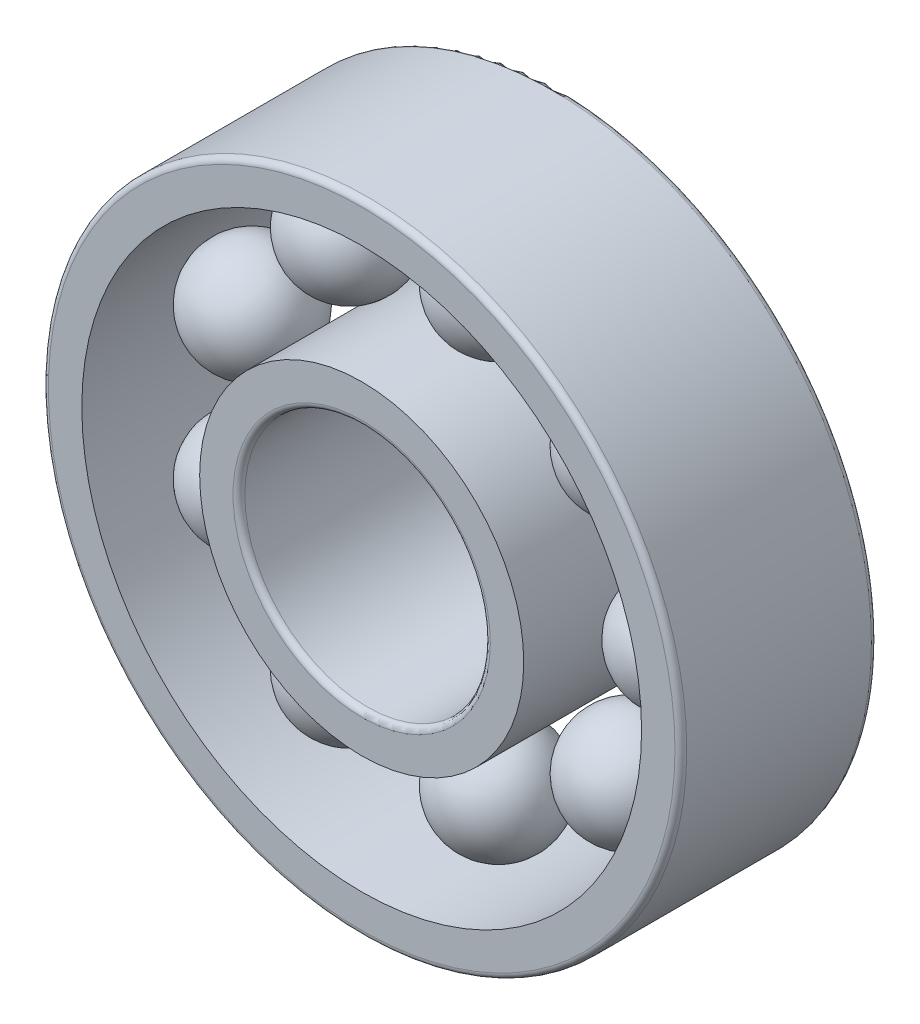
ISO-10303-21;
HEADER;
FILE_DESCRIPTION(('STEP AP214'),'2;1');
FILE_NAME('part.step','',(''),(''),'','','');
FILE_SCHEMA(('AUTOMOTIVE_DESIGN { 1 0 10303 214 1 1 1 1 }'));
ENDSEC;
DATA;
#1=APPLICATION_CONTEXT('core data for automotive mechanical design processes');
#2=APPLICATION_PROTOCOL_DEFINITION('international standard','automotive_design',2000,#1);
#3=PRODUCT_CONTEXT('',#1,'mechanical');
#4=PRODUCT('Part','Part','',(#3));
#5=PRODUCT_RELATED_PRODUCT_CATEGORY('part','',(#4));
#6=PRODUCT_DEFINITION_FORMATION('','',#4);
#7=PRODUCT_DEFINITION_CONTEXT('part definition',#1,'design');
#8=PRODUCT_DEFINITION('design','',#6,#7);
#9=PRODUCT_DEFINITION_SHAPE('','',#8);
#10=(LENGTH_UNIT() NAMED_UNIT(*) SI_UNIT(.MILLI.,.METRE.));
#11=(NAMED_UNIT(*) PLANE_ANGLE_UNIT() SI_UNIT($,.RADIAN.));
#12=(NAMED_UNIT(*) SI_UNIT($,.STERADIAN.) SOLID_ANGLE_UNIT());
#13=UNCERTAINTY_MEASURE_WITH_UNIT(LENGTH_MEASURE(1.E-05),#10,'distance_accuracy_value','');
#14=(GEOMETRIC_REPRESENTATION_CONTEXT(3) GLOBAL_UNCERTAINTY_ASSIGNED_CONTEXT((#13)) GLOBAL_UNIT_ASSIGNED_CONTEXT((#10,
#11,#12)) REPRESENTATION_CONTEXT('',''));
#15=CARTESIAN_POINT('',(0.,0.,0.));
#16=DIRECTION('',(0.,0.,1.));
#17=DIRECTION('',(1.,0.,0.));
#18=AXIS2_PLACEMENT_3D('',#15,#16,#17);
#19=CARTESIAN_POINT('',(6.8943999880708,-5.78508848717886,0.));
#20=DIRECTION('',(-0.766044443118978,0.64278760968654,0.));
#21=DIRECTION('',(0.,0.,-1.));
#22=AXIS2_PLACEMENT_3D('',#19,#20,#21);
#23=SPHERICAL_SURFACE('',#22,2.28);
#24=CARTESIAN_POINT('',(5.14781865775953,-4.31953273709355,0.));
#25=VERTEX_POINT('',#24);
#26=VERTEX_LOOP('',#25);
#27=FACE_BOUND('',#26,.T.);
#28=ADVANCED_FACE('F38',(#27),#23,.T.);
#29=CLOSED_SHELL('',(#28));
#30=MANIFOLD_SOLID_BREP('B2',#29);
#31=CARTESIAN_POINT('',(1.56283359900237,-8.86326977710987,0.));
#32=DIRECTION('',(-0.17364817766693,0.984807753012208,0.));
#33=DIRECTION('',(0.,0.,-1.));
#34=AXIS2_PLACEMENT_3D('',#31,#32,#33);
#35=SPHERICAL_SURFACE('',#34,2.28);
#36=CARTESIAN_POINT('',(1.16691575392177,-6.61790810024204,0.));
#37=VERTEX_POINT('',#36);
#38=VERTEX_LOOP('',#37);
#39=FACE_BOUND('',#38,.T.);
#40=ADVANCED_FACE('F57',(#39),#35,.T.);
#41=CLOSED_SHELL('',(#40));
#42=MANIFOLD_SOLID_BREP('B6',#41);
#43=CARTESIAN_POINT('',(-4.5,-7.79422863405995,0.));
#44=DIRECTION('',(0.5,0.866025403784438,0.));
#45=DIRECTION('',(0.,0.,-1.));
#46=AXIS2_PLACEMENT_3D('',#43,#44,#45);
#47=SPHERICAL_SURFACE('',#46,2.28);
#48=CARTESIAN_POINT('',(-3.36,-5.81969071343143,0.));
#49=VERTEX_POINT('',#48);
#50=VERTEX_LOOP('',#49);
#51=FACE_BOUND('',#50,.T.);
#52=ADVANCED_FACE('F76',(#51),#47,.T.);
#53=CLOSED_SHELL('',(#52));
#54=MANIFOLD_SOLID_BREP('B34',#53);
#55=CARTESIAN_POINT('',(-8.45723358707318,-3.07818128993102,0.));
#56=DIRECTION('',(0.939692620785908,0.342020143325669,0.));
#57=DIRECTION('',(0.,0.,-1.));
#58=AXIS2_PLACEMENT_3D('',#55,#56,#57);
#59=SPHERICAL_SURFACE('',#58,2.28);
#60=CARTESIAN_POINT('',(-6.3147344116813,-2.29837536314849,0.));
#61=VERTEX_POINT('',#60);
#62=VERTEX_LOOP('',#61);
#63=FACE_BOUND('',#62,.T.);
#64=ADVANCED_FACE('F95',(#63),#59,.T.);
#65=CLOSED_SHELL('',(#64));
#66=MANIFOLD_SOLID_BREP('B53',#65);
#67=CARTESIAN_POINT('',(-8.45723358707318,3.07818128993102,0.));
#68=DIRECTION('',(0.939692620785909,-0.342020143325669,0.));
#69=DIRECTION('',(0.,0.,-1.));
#70=AXIS2_PLACEMENT_3D('',#67,#68,#69);
#71=SPHERICAL_SURFACE('',#70,2.28);
#72=CARTESIAN_POINT('',(-6.31473441168131,2.2983753631485,0.));
#73=VERTEX_POINT('',#72);
#74=VERTEX_LOOP('',#73);
#75=FACE_BOUND('',#74,.T.);
#76=ADVANCED_FACE('F114',(#75),#71,.T.);
#77=CLOSED_SHELL('',(#76));
#78=MANIFOLD_SOLID_BREP('B72',#77);
#79=CARTESIAN_POINT('',(-4.5,7.79422863405995,0.));
#80=DIRECTION('',(0.5,-0.866025403784439,0.));
#81=DIRECTION('',(0.,0.,-1.));
#82=AXIS2_PLACEMENT_3D('',#79,#80,#81);
#83=SPHERICAL_SURFACE('',#82,2.28);
#84=CARTESIAN_POINT('',(-3.36,5.81969071343143,0.));
#85=VERTEX_POINT('',#84);
#86=VERTEX_LOOP('',#85);
#87=FACE_BOUND('',#86,.T.);
#88=ADVANCED_FACE('F133',(#87),#83,.T.);
#89=CLOSED_SHELL('',(#88));
#90=MANIFOLD_SOLID_BREP('B91',#89);
#91=CARTESIAN_POINT('',(1.56283359900237,8.86326977710987,0.));
#92=DIRECTION('',(-0.17364817766693,-0.984807753012208,0.));
#93=DIRECTION('',(0.,0.,-1.));
#94=AXIS2_PLACEMENT_3D('',#91,#92,#93);
#95=SPHERICAL_SURFACE('',#94,2.28);
#96=CARTESIAN_POINT('',(1.16691575392177,6.61790810024204,0.));
#97=VERTEX_POINT('',#96);
#98=VERTEX_LOOP('',#97);
#99=FACE_BOUND('',#98,.T.);
#100=ADVANCED_FACE('F152',(#99),#95,.T.);
#101=CLOSED_SHELL('',(#100));
#102=MANIFOLD_SOLID_BREP('B110',#101);
#103=CARTESIAN_POINT('',(6.8943999880708,5.78508848717886,0.));
#104=DIRECTION('',(-0.766044443118978,-0.642787609686539,0.));
#105=DIRECTION('',(0.,0.,-1.));
#106=AXIS2_PLACEMENT_3D('',#103,#104,#105);
#107=SPHERICAL_SURFACE('',#106,2.28);
#108=CARTESIAN_POINT('',(5.14781865775953,4.31953273709355,0.));
#109=VERTEX_POINT('',#108);
#110=VERTEX_LOOP('',#109);
#111=FACE_BOUND('',#110,.T.);
#112=ADVANCED_FACE('F171',(#111),#107,.T.);
#113=CLOSED_SHELL('',(#112));
#114=MANIFOLD_SOLID_BREP('B129',#113);
#115=CARTESIAN_POINT('',(9.,0.,0.));
#116=DIRECTION('',(-1.,0.,0.));
#117=DIRECTION('',(0.,0.,-1.));
#118=AXIS2_PLACEMENT_3D('',#115,#116,#117);
#119=SPHERICAL_SURFACE('',#118,2.28);
#120=CARTESIAN_POINT('',(6.72,0.,0.));
#121=VERTEX_POINT('',#120);
#122=VERTEX_LOOP('',#121);
#123=FACE_BOUND('',#122,.T.);
#124=ADVANCED_FACE('F192',(#123),#119,.T.);
#125=CLOSED_SHELL('',(#124));
#126=MANIFOLD_SOLID_BREP('B148',#125);
#127=CARTESIAN_POINT('',(0.,0.,7.));
#128=DIRECTION('',(0.,0.,1.));
#129=DIRECTION('',(1.,0.,0.));
#130=AXIS2_PLACEMENT_3D('',#127,#128,#129);
#131=CYLINDRICAL_SURFACE('',#130,11.4);
#132=CARTESIAN_POINT('',(0.,0.,4.));
#133=DIRECTION('',(0.,0.,1.));
#134=DIRECTION('',(1.,0.,0.));
#135=AXIS2_PLACEMENT_3D('',#132,#133,#134);
#136=CIRCLE('',#135,11.4);
#137=CARTESIAN_POINT('',(11.4,0.,4.));
#138=VERTEX_POINT('',#137);
#139=EDGE_CURVE('E232',#138,#138,#136,.T.);
#140=ORIENTED_EDGE('',*,*,#139,.T.);
#141=EDGE_LOOP('',(#140));
#142=FACE_BOUND('',#141,.T.);
#143=CARTESIAN_POINT('',(0.,0.,-4.));
#144=DIRECTION('',(0.,0.,1.));
#145=DIRECTION('',(1.,0.,0.));
#146=AXIS2_PLACEMENT_3D('',#143,#144,#145);
#147=CIRCLE('',#146,11.4);
#148=CARTESIAN_POINT('',(11.4,0.,-4.));
#149=VERTEX_POINT('',#148);
#150=EDGE_CURVE('E235',#149,#149,#147,.T.);
#151=ORIENTED_EDGE('',*,*,#150,.F.);
#152=EDGE_LOOP('',(#151));
#153=FACE_BOUND('',#152,.T.);
#154=ADVANCED_FACE('F212',(#142,#153),#131,.F.);
#155=CARTESIAN_POINT('',(11.4,0.,4.));
#156=DIRECTION('',(0.,0.,1.));
#157=DIRECTION('',(1.,0.,0.));
#158=AXIS2_PLACEMENT_3D('',#155,#156,#157);
#159=PLANE('',#158);
#160=CARTESIAN_POINT('',(0.,0.,4.));
#161=DIRECTION('',(0.,0.,1.));
#162=DIRECTION('',(1.,0.,0.));
#163=AXIS2_PLACEMENT_3D('',#160,#161,#162);
#164=CIRCLE('',#163,12.76);
#165=CARTESIAN_POINT('',(12.76,0.,4.));
#166=VERTEX_POINT('',#165);
#167=EDGE_CURVE('E191',#166,#166,#164,.T.);
#168=ORIENTED_EDGE('',*,*,#167,.T.);
#169=EDGE_LOOP('',(#168));
#170=FACE_BOUND('',#169,.T.);
#171=ORIENTED_EDGE('',*,*,#139,.F.);
#172=EDGE_LOOP('',(#171));
#173=FACE_BOUND('',#172,.T.);
#174=ADVANCED_FACE('F242',(#170,#173),#159,.T.);
#175=CARTESIAN_POINT('',(0.,0.,7.));
#176=DIRECTION('',(0.,0.,1.));
#177=DIRECTION('',(1.,0.,0.));
#178=AXIS2_PLACEMENT_3D('',#175,#176,#177);
#179=CYLINDRICAL_SURFACE('',#178,13.);
#180=CARTESIAN_POINT('',(0.,0.,-3.76));
#181=DIRECTION('',(0.,0.,-1.));
#182=DIRECTION('',(-1.,0.,0.));
#183=AXIS2_PLACEMENT_3D('',#180,#181,#182);
#184=CIRCLE('',#183,13.);
#185=CARTESIAN_POINT('',(-13.,0.,-3.76));
#186=VERTEX_POINT('',#185);
#187=EDGE_CURVE('E223',#186,#186,#184,.F.);
#188=ORIENTED_EDGE('',*,*,#187,.T.);
#189=EDGE_LOOP('',(#188));
#190=FACE_BOUND('',#189,.T.);
#191=CARTESIAN_POINT('',(0.,0.,3.76));
#192=DIRECTION('',(0.,0.,1.));
#193=DIRECTION('',(1.,0.,0.));
#194=AXIS2_PLACEMENT_3D('',#191,#192,#193);
#195=CIRCLE('',#194,13.);
#196=CARTESIAN_POINT('',(13.,0.,3.76));
#197=VERTEX_POINT('',#196);
#198=EDGE_CURVE('E227',#197,#197,#195,.F.);
#199=ORIENTED_EDGE('',*,*,#198,.T.);
#200=EDGE_LOOP('',(#199));
#201=FACE_BOUND('',#200,.T.);
#202=ADVANCED_FACE('F248',(#190,#201),#179,.T.);
#203=CARTESIAN_POINT('',(13.,0.,-4.));
#204=DIRECTION('',(0.,0.,-1.));
#205=DIRECTION('',(-1.,0.,0.));
#206=AXIS2_PLACEMENT_3D('',#203,#204,#205);
#207=PLANE('',#206);
#208=CARTESIAN_POINT('',(0.,0.,-4.));
#209=DIRECTION('',(0.,0.,-1.));
#210=DIRECTION('',(-1.,0.,0.));
#211=AXIS2_PLACEMENT_3D('',#208,#209,#210);
#212=CIRCLE('',#211,12.76);
#213=CARTESIAN_POINT('',(-12.76,0.,-4.));
#214=VERTEX_POINT('',#213);
#215=EDGE_CURVE('E219',#214,#214,#212,.T.);
#216=ORIENTED_EDGE('',*,*,#215,.T.);
#217=EDGE_LOOP('',(#216));
#218=FACE_BOUND('',#217,.T.);
#219=ORIENTED_EDGE('',*,*,#150,.T.);
#220=EDGE_LOOP('',(#219));
#221=FACE_BOUND('',#220,.T.);
#222=ADVANCED_FACE('F239',(#218,#221),#207,.T.);
#223=CARTESIAN_POINT('',(0.,0.,-3.76));
#224=DIRECTION('',(0.,0.,-1.));
#225=DIRECTION('',(-1.,0.,0.));
#226=AXIS2_PLACEMENT_3D('',#223,#224,#225);
#227=TOROIDAL_SURFACE('',#226,12.76,0.24);
#228=ORIENTED_EDGE('',*,*,#215,.F.);
#229=EDGE_LOOP('',(#228));
#230=FACE_BOUND('',#229,.T.);
#231=ORIENTED_EDGE('',*,*,#187,.F.);
#232=EDGE_LOOP('',(#231));
#233=FACE_BOUND('',#232,.T.);
#234=ADVANCED_FACE('F251',(#230,#233),#227,.T.);
#235=CARTESIAN_POINT('',(0.,0.,3.76));
#236=DIRECTION('',(0.,0.,1.));
#237=DIRECTION('',(1.,0.,0.));
#238=AXIS2_PLACEMENT_3D('',#235,#236,#237);
#239=TOROIDAL_SURFACE('',#238,12.76,0.24);
#240=ORIENTED_EDGE('',*,*,#198,.F.);
#241=EDGE_LOOP('',(#240));
#242=FACE_BOUND('',#241,.T.);
#243=ORIENTED_EDGE('',*,*,#167,.F.);
#244=EDGE_LOOP('',(#243));
#245=FACE_BOUND('',#244,.T.);
#246=ADVANCED_FACE('F214',(#242,#245),#239,.T.);
#247=CLOSED_SHELL('',(#154,#174,#202,#222,#234,#246));
#248=MANIFOLD_SOLID_BREP('B167',#247);
#249=CARTESIAN_POINT('',(0.,0.,7.));
#250=DIRECTION('',(0.,0.,1.));
#251=DIRECTION('',(1.,0.,0.));
#252=AXIS2_PLACEMENT_3D('',#249,#250,#251);
#253=CYLINDRICAL_SURFACE('',#252,5.);
#254=CARTESIAN_POINT('',(0.,0.,-3.76));
#255=DIRECTION('',(0.,0.,-1.));
#256=DIRECTION('',(-1.,0.,0.));
#257=AXIS2_PLACEMENT_3D('',#254,#255,#256);
#258=CIRCLE('',#257,5.);
#259=CARTESIAN_POINT('',(-5.,0.,-3.76));
#260=VERTEX_POINT('',#259);
#261=EDGE_CURVE('E311',#260,#260,#258,.T.);
#262=ORIENTED_EDGE('',*,*,#261,.T.);
#263=EDGE_LOOP('',(#262));
#264=FACE_BOUND('',#263,.T.);
#265=CARTESIAN_POINT('',(0.,0.,3.76));
#266=DIRECTION('',(0.,0.,1.));
#267=DIRECTION('',(1.,0.,0.));
#268=AXIS2_PLACEMENT_3D('',#265,#266,#267);
#269=CIRCLE('',#268,5.);
#270=CARTESIAN_POINT('',(5.,0.,3.76));
#271=VERTEX_POINT('',#270);
#272=EDGE_CURVE('E315',#271,#271,#269,.T.);
#273=ORIENTED_EDGE('',*,*,#272,.T.);
#274=EDGE_LOOP('',(#273));
#275=FACE_BOUND('',#274,.T.);
#276=ADVANCED_FACE('F304',(#264,#275),#253,.F.);
#277=CARTESIAN_POINT('',(5.,0.,4.));
#278=DIRECTION('',(0.,0.,1.));
#279=DIRECTION('',(1.,0.,0.));
#280=AXIS2_PLACEMENT_3D('',#277,#278,#279);
#281=PLANE('',#280);
#282=CARTESIAN_POINT('',(0.,0.,4.));
#283=DIRECTION('',(0.,0.,1.));
#284=DIRECTION('',(1.,0.,0.));
#285=AXIS2_PLACEMENT_3D('',#282,#283,#284);
#286=CIRCLE('',#285,5.24);
#287=CARTESIAN_POINT('',(5.24,0.,4.));
#288=VERTEX_POINT('',#287);
#289=EDGE_CURVE('E211',#288,#288,#286,.F.);
#290=ORIENTED_EDGE('',*,*,#289,.T.);
#291=EDGE_LOOP('',(#290));
#292=FACE_BOUND('',#291,.T.);
#293=CARTESIAN_POINT('',(0.,0.,4.));
#294=DIRECTION('',(0.,0.,1.));
#295=DIRECTION('',(1.,0.,0.));
#296=AXIS2_PLACEMENT_3D('',#293,#294,#295);
#297=CIRCLE('',#296,6.6);
#298=CARTESIAN_POINT('',(6.6,0.,4.));
#299=VERTEX_POINT('',#298);
#300=EDGE_CURVE('E324',#299,#299,#297,.T.);
#301=ORIENTED_EDGE('',*,*,#300,.T.);
#302=EDGE_LOOP('',(#301));
#303=FACE_BOUND('',#302,.T.);
#304=ADVANCED_FACE('F344',(#292,#303),#281,.T.);
#305=CARTESIAN_POINT('',(0.,0.,7.));
#306=DIRECTION('',(0.,0.,1.));
#307=DIRECTION('',(1.,0.,0.));
#308=AXIS2_PLACEMENT_3D('',#305,#306,#307);
#309=CYLINDRICAL_SURFACE('',#308,6.6);
#310=CARTESIAN_POINT('',(0.,0.,-4.));
#311=DIRECTION('',(0.,0.,1.));
#312=DIRECTION('',(1.,0.,0.));
#313=AXIS2_PLACEMENT_3D('',#310,#311,#312);
#314=CIRCLE('',#313,6.6);
#315=CARTESIAN_POINT('',(6.6,0.,-4.));
#316=VERTEX_POINT('',#315);
#317=EDGE_CURVE('E327',#316,#316,#314,.T.);
#318=ORIENTED_EDGE('',*,*,#317,.T.);
#319=EDGE_LOOP('',(#318));
#320=FACE_BOUND('',#319,.T.);
#321=ORIENTED_EDGE('',*,*,#300,.F.);
#322=EDGE_LOOP('',(#321));
#323=FACE_BOUND('',#322,.T.);
#324=ADVANCED_FACE('F331',(#320,#323),#309,.T.);
#325=CARTESIAN_POINT('',(6.6,0.,-4.));
#326=DIRECTION('',(0.,0.,-1.));
#327=DIRECTION('',(-1.,0.,0.));
#328=AXIS2_PLACEMENT_3D('',#325,#326,#327);
#329=PLANE('',#328);
#330=CARTESIAN_POINT('',(0.,0.,-4.));
#331=DIRECTION('',(0.,0.,-1.));
#332=DIRECTION('',(-1.,0.,0.));
#333=AXIS2_PLACEMENT_3D('',#330,#331,#332);
#334=CIRCLE('',#333,5.24);
#335=CARTESIAN_POINT('',(-5.24,0.,-4.));
#336=VERTEX_POINT('',#335);
#337=EDGE_CURVE('E319',#336,#336,#334,.F.);
#338=ORIENTED_EDGE('',*,*,#337,.T.);
#339=EDGE_LOOP('',(#338));
#340=FACE_BOUND('',#339,.T.);
#341=ORIENTED_EDGE('',*,*,#317,.F.);
#342=EDGE_LOOP('',(#341));
#343=FACE_BOUND('',#342,.T.);
#344=ADVANCED_FACE('F334',(#340,#343),#329,.T.);
#345=CARTESIAN_POINT('',(0.,0.,-3.76));
#346=DIRECTION('',(0.,0.,-1.));
#347=DIRECTION('',(-1.,0.,0.));
#348=AXIS2_PLACEMENT_3D('',#345,#346,#347);
#349=TOROIDAL_SURFACE('',#348,5.24,0.24);
#350=ORIENTED_EDGE('',*,*,#261,.F.);
#351=EDGE_LOOP('',(#350));
#352=FACE_BOUND('',#351,.T.);
#353=ORIENTED_EDGE('',*,*,#337,.F.);
#354=EDGE_LOOP('',(#353));
#355=FACE_BOUND('',#354,.T.);
#356=ADVANCED_FACE('F336',(#352,#355),#349,.T.);
#357=CARTESIAN_POINT('',(0.,0.,3.76));
#358=DIRECTION('',(0.,0.,1.));
#359=DIRECTION('',(1.,0.,0.));
#360=AXIS2_PLACEMENT_3D('',#357,#358,#359);
#361=TOROIDAL_SURFACE('',#360,5.24,0.24);
#362=ORIENTED_EDGE('',*,*,#289,.F.);
#363=EDGE_LOOP('',(#362));
#364=FACE_BOUND('',#363,.T.);
#365=ORIENTED_EDGE('',*,*,#272,.F.);
#366=EDGE_LOOP('',(#365));
#367=FACE_BOUND('',#366,.T.);
#368=ADVANCED_FACE('F306',(#364,#367),#361,.T.);
#369=CLOSED_SHELL('',(#276,#304,#324,#344,#356,#368));
#370=MANIFOLD_SOLID_BREP('B186',#369);
#371=ADVANCED_BREP_SHAPE_REPRESENTATION('',(#18,#30,#42,#54,#66,#78,#90,#102,#114,#126,#248,
#370),#14);
#372=SHAPE_DEFINITION_REPRESENTATION(#9,#371);
ENDSEC;
END-ISO-10303-21;
